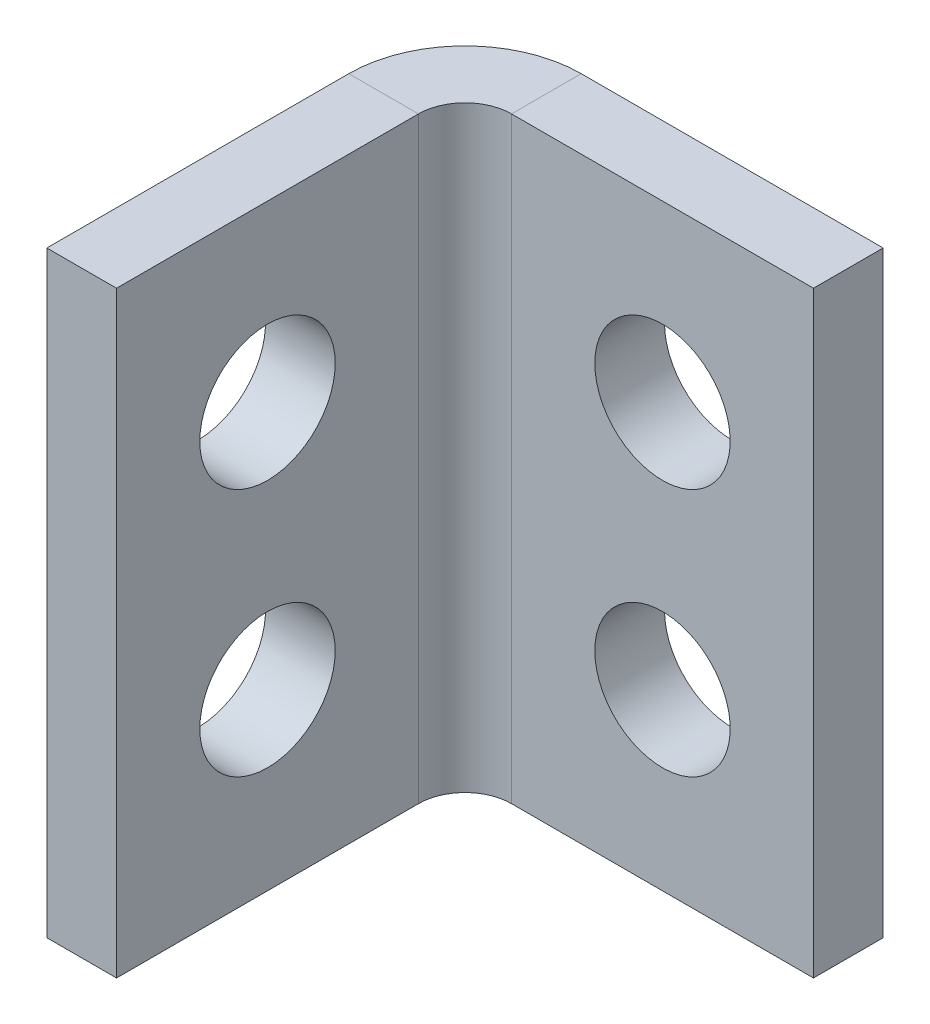
ISO-10303-21;
HEADER;
FILE_DESCRIPTION(('STEP AP214'),'2;1');
FILE_NAME('part.step','',(''),(''),'','','');
FILE_SCHEMA(('AUTOMOTIVE_DESIGN { 1 0 10303 214 1 1 1 1 }'));
ENDSEC;
DATA;
#1=APPLICATION_CONTEXT('core data for automotive mechanical design processes');
#2=APPLICATION_PROTOCOL_DEFINITION('international standard','automotive_design',2000,#1);
#3=PRODUCT_CONTEXT('',#1,'mechanical');
#4=PRODUCT('Part','Part','',(#3));
#5=PRODUCT_RELATED_PRODUCT_CATEGORY('part','',(#4));
#6=PRODUCT_DEFINITION_FORMATION('','',#4);
#7=PRODUCT_DEFINITION_CONTEXT('part definition',#1,'design');
#8=PRODUCT_DEFINITION('design','',#6,#7);
#9=PRODUCT_DEFINITION_SHAPE('','',#8);
#10=(LENGTH_UNIT() NAMED_UNIT(*) SI_UNIT(.MILLI.,.METRE.));
#11=(NAMED_UNIT(*) PLANE_ANGLE_UNIT() SI_UNIT($,.RADIAN.));
#12=(NAMED_UNIT(*) SI_UNIT($,.STERADIAN.) SOLID_ANGLE_UNIT());
#13=UNCERTAINTY_MEASURE_WITH_UNIT(LENGTH_MEASURE(1.E-05),#10,'distance_accuracy_value','');
#14=(GEOMETRIC_REPRESENTATION_CONTEXT(3) GLOBAL_UNCERTAINTY_ASSIGNED_CONTEXT((#13)) GLOBAL_UNIT_ASSIGNED_CONTEXT((#10,
#11,#12)) REPRESENTATION_CONTEXT('',''));
#15=CARTESIAN_POINT('',(0.,0.,0.));
#16=DIRECTION('',(0.,0.,1.));
#17=DIRECTION('',(1.,0.,0.));
#18=AXIS2_PLACEMENT_3D('',#15,#16,#17);
#19=CARTESIAN_POINT('',(0.,0.,-1.75));
#20=DIRECTION('',(0.,-1.,0.));
#21=DIRECTION('',(0.,0.,-1.));
#22=AXIS2_PLACEMENT_3D('',#19,#20,#21);
#23=PLANE('',#22);
#24=DIRECTION('',(1.,0.,0.));
#25=VECTOR('',#24,1.);
#26=CARTESIAN_POINT('',(0.,0.,0.));
#27=LINE('',#26,#25);
#28=CARTESIAN_POINT('',(1.1684,0.,0.));
#29=VERTEX_POINT('',#28);
#30=CARTESIAN_POINT('',(8.75,0.,0.));
#31=VERTEX_POINT('',#30);
#32=EDGE_CURVE('E103',#29,#31,#27,.T.);
#33=ORIENTED_EDGE('',*,*,#32,.F.);
#34=DIRECTION('',(0.,0.,-1.));
#35=VECTOR('',#34,1.);
#36=CARTESIAN_POINT('',(1.1684,0.,0.));
#37=LINE('',#36,#35);
#38=CARTESIAN_POINT('',(1.1684,0.,-1.75));
#39=VERTEX_POINT('',#38);
#40=EDGE_CURVE('E123',#29,#39,#37,.T.);
#41=ORIENTED_EDGE('',*,*,#40,.T.);
#42=DIRECTION('',(1.,0.,0.));
#43=VECTOR('',#42,1.);
#44=CARTESIAN_POINT('',(0.,0.,-1.75));
#45=LINE('',#44,#43);
#46=CARTESIAN_POINT('',(8.75,0.,-1.75));
#47=VERTEX_POINT('',#46);
#48=EDGE_CURVE('E110',#39,#47,#45,.T.);
#49=ORIENTED_EDGE('',*,*,#48,.T.);
#50=DIRECTION('',(0.,0.,1.));
#51=VECTOR('',#50,1.);
#52=CARTESIAN_POINT('',(8.75,0.,-1.75));
#53=LINE('',#52,#51);
#54=EDGE_CURVE('E52',#47,#31,#53,.T.);
#55=ORIENTED_EDGE('',*,*,#54,.T.);
#56=EDGE_LOOP('',(#33,#41,#49,#55));
#57=FACE_BOUND('',#56,.T.);
#58=ADVANCED_FACE('F49',(#57),#23,.T.);
#59=CARTESIAN_POINT('',(0.,0.,-1.75));
#60=DIRECTION('',(0.,0.,-1.));
#61=DIRECTION('',(-1.,0.,0.));
#62=AXIS2_PLACEMENT_3D('',#59,#60,#61);
#63=PLANE('',#62);
#64=CARTESIAN_POINT('',(4.9592,10.625,-1.75));
#65=DIRECTION('',(0.,0.,-1.));
#66=DIRECTION('',(-1.,0.,0.));
#67=AXIS2_PLACEMENT_3D('',#64,#65,#66);
#68=CIRCLE('',#67,1.69999999999999);
#69=CARTESIAN_POINT('',(3.25920000000001,10.625,-1.75));
#70=VERTEX_POINT('',#69);
#71=EDGE_CURVE('E209',#70,#70,#68,.T.);
#72=ORIENTED_EDGE('',*,*,#71,.F.);
#73=EDGE_LOOP('',(#72));
#74=FACE_BOUND('',#73,.T.);
#75=CARTESIAN_POINT('',(4.9592,4.375,-1.75));
#76=DIRECTION('',(0.,0.,-1.));
#77=DIRECTION('',(-1.,0.,0.));
#78=AXIS2_PLACEMENT_3D('',#75,#76,#77);
#79=CIRCLE('',#78,1.69999999999999);
#80=CARTESIAN_POINT('',(3.25920000000001,4.375,-1.75));
#81=VERTEX_POINT('',#80);
#82=EDGE_CURVE('E208',#81,#81,#79,.T.);
#83=ORIENTED_EDGE('',*,*,#82,.F.);
#84=EDGE_LOOP('',(#83));
#85=FACE_BOUND('',#84,.T.);
#86=ORIENTED_EDGE('',*,*,#48,.F.);
#87=DIRECTION('',(0.,-1.,0.));
#88=VECTOR('',#87,1.);
#89=CARTESIAN_POINT('',(1.1684,0.,-1.75));
#90=LINE('',#89,#88);
#91=CARTESIAN_POINT('',(1.1684,15.,-1.75));
#92=VERTEX_POINT('',#91);
#93=EDGE_CURVE('E144',#39,#92,#90,.F.);
#94=ORIENTED_EDGE('',*,*,#93,.T.);
#95=DIRECTION('',(-1.,0.,0.));
#96=VECTOR('',#95,1.);
#97=CARTESIAN_POINT('',(0.,15.,-1.75));
#98=LINE('',#97,#96);
#99=CARTESIAN_POINT('',(8.75,15.,-1.75));
#100=VERTEX_POINT('',#99);
#101=EDGE_CURVE('E119',#100,#92,#98,.T.);
#102=ORIENTED_EDGE('',*,*,#101,.F.);
#103=DIRECTION('',(0.,1.,0.));
#104=VECTOR('',#103,1.);
#105=CARTESIAN_POINT('',(8.75,0.,-1.75));
#106=LINE('',#105,#104);
#107=EDGE_CURVE('E93',#47,#100,#106,.T.);
#108=ORIENTED_EDGE('',*,*,#107,.F.);
#109=EDGE_LOOP('',(#86,#94,#102,#108));
#110=FACE_BOUND('',#109,.T.);
#111=ADVANCED_FACE('F289',(#74,#85,#110),#63,.T.);
#112=CARTESIAN_POINT('',(0.,0.,0.));
#113=DIRECTION('',(0.,0.,-1.));
#114=DIRECTION('',(-1.,0.,0.));
#115=AXIS2_PLACEMENT_3D('',#112,#113,#114);
#116=PLANE('',#115);
#117=CARTESIAN_POINT('',(4.9592,10.625,0.));
#118=DIRECTION('',(0.,0.,-1.));
#119=DIRECTION('',(-1.,0.,0.));
#120=AXIS2_PLACEMENT_3D('',#117,#118,#119);
#121=CIRCLE('',#120,1.69999999999999);
#122=CARTESIAN_POINT('',(3.2592,10.625,0.));
#123=VERTEX_POINT('',#122);
#124=EDGE_CURVE('E202',#123,#123,#121,.T.);
#125=ORIENTED_EDGE('',*,*,#124,.T.);
#126=EDGE_LOOP('',(#125));
#127=FACE_BOUND('',#126,.T.);
#128=CARTESIAN_POINT('',(4.9592,4.375,0.));
#129=DIRECTION('',(0.,0.,-1.));
#130=DIRECTION('',(-1.,0.,0.));
#131=AXIS2_PLACEMENT_3D('',#128,#129,#130);
#132=CIRCLE('',#131,1.69999999999999);
#133=CARTESIAN_POINT('',(3.25920000000001,4.375,0.));
#134=VERTEX_POINT('',#133);
#135=EDGE_CURVE('E211',#134,#134,#132,.T.);
#136=ORIENTED_EDGE('',*,*,#135,.T.);
#137=EDGE_LOOP('',(#136));
#138=FACE_BOUND('',#137,.T.);
#139=DIRECTION('',(0.,-1.,0.));
#140=VECTOR('',#139,1.);
#141=CARTESIAN_POINT('',(1.1684,0.,0.));
#142=LINE('',#141,#140);
#143=CARTESIAN_POINT('',(1.1684,15.,0.));
#144=VERTEX_POINT('',#143);
#145=EDGE_CURVE('E131',#29,#144,#142,.F.);
#146=ORIENTED_EDGE('',*,*,#145,.F.);
#147=ORIENTED_EDGE('',*,*,#32,.T.);
#148=DIRECTION('',(0.,1.,0.));
#149=VECTOR('',#148,1.);
#150=CARTESIAN_POINT('',(8.75,0.,0.));
#151=LINE('',#150,#149);
#152=CARTESIAN_POINT('',(8.75,15.,0.));
#153=VERTEX_POINT('',#152);
#154=EDGE_CURVE('E91',#31,#153,#151,.T.);
#155=ORIENTED_EDGE('',*,*,#154,.T.);
#156=DIRECTION('',(-1.,0.,0.));
#157=VECTOR('',#156,1.);
#158=CARTESIAN_POINT('',(0.,15.,0.));
#159=LINE('',#158,#157);
#160=EDGE_CURVE('E100',#153,#144,#159,.T.);
#161=ORIENTED_EDGE('',*,*,#160,.T.);
#162=EDGE_LOOP('',(#146,#147,#155,#161));
#163=FACE_BOUND('',#162,.T.);
#164=ADVANCED_FACE('F98',(#127,#138,#163),#116,.F.);
#165=CARTESIAN_POINT('',(0.,15.,-1.75));
#166=DIRECTION('',(0.,1.,0.));
#167=DIRECTION('',(0.,0.,1.));
#168=AXIS2_PLACEMENT_3D('',#165,#166,#167);
#169=PLANE('',#168);
#170=DIRECTION('',(0.,0.,-1.));
#171=VECTOR('',#170,1.);
#172=CARTESIAN_POINT('',(1.1684,15.,0.));
#173=LINE('',#172,#171);
#174=EDGE_CURVE('E108',#144,#92,#173,.T.);
#175=ORIENTED_EDGE('',*,*,#174,.F.);
#176=ORIENTED_EDGE('',*,*,#160,.F.);
#177=DIRECTION('',(0.,0.,1.));
#178=VECTOR('',#177,1.);
#179=CARTESIAN_POINT('',(8.75,15.,-1.75));
#180=LINE('',#179,#178);
#181=EDGE_CURVE('E12',#100,#153,#180,.T.);
#182=ORIENTED_EDGE('',*,*,#181,.F.);
#183=ORIENTED_EDGE('',*,*,#101,.T.);
#184=EDGE_LOOP('',(#175,#176,#182,#183));
#185=FACE_BOUND('',#184,.T.);
#186=ADVANCED_FACE('F107',(#185),#169,.T.);
#187=CARTESIAN_POINT('',(8.75,0.,-1.75));
#188=DIRECTION('',(1.,0.,0.));
#189=DIRECTION('',(0.,0.,-1.));
#190=AXIS2_PLACEMENT_3D('',#187,#188,#189);
#191=PLANE('',#190);
#192=ORIENTED_EDGE('',*,*,#154,.F.);
#193=ORIENTED_EDGE('',*,*,#54,.F.);
#194=ORIENTED_EDGE('',*,*,#107,.T.);
#195=ORIENTED_EDGE('',*,*,#181,.T.);
#196=EDGE_LOOP('',(#192,#193,#194,#195));
#197=FACE_BOUND('',#196,.T.);
#198=ADVANCED_FACE('F89',(#197),#191,.T.);
#199=CARTESIAN_POINT('',(1.1684,15.,1.1684));
#200=DIRECTION('',(0.,1.,0.));
#201=DIRECTION('',(0.,0.,1.));
#202=AXIS2_PLACEMENT_3D('',#199,#200,#201);
#203=PLANE('',#202);
#204=DIRECTION('',(-1.,0.,0.));
#205=VECTOR('',#204,1.);
#206=CARTESIAN_POINT('',(0.,15.,1.1684));
#207=LINE('',#206,#205);
#208=CARTESIAN_POINT('',(0.,15.,1.1684));
#209=VERTEX_POINT('',#208);
#210=CARTESIAN_POINT('',(-1.75,15.,1.16839999999999));
#211=VERTEX_POINT('',#210);
#212=EDGE_CURVE('E183',#209,#211,#207,.T.);
#213=ORIENTED_EDGE('',*,*,#212,.F.);
#214=CARTESIAN_POINT('',(1.1684,15.,1.1684));
#215=DIRECTION('',(0.,-1.,0.));
#216=DIRECTION('',(0.,0.,-1.));
#217=AXIS2_PLACEMENT_3D('',#214,#215,#216);
#218=CIRCLE('',#217,1.1684);
#219=EDGE_CURVE('E136',#144,#209,#218,.F.);
#220=ORIENTED_EDGE('',*,*,#219,.F.);
#221=ORIENTED_EDGE('',*,*,#174,.T.);
#222=CARTESIAN_POINT('',(1.1684,15.,1.1684));
#223=DIRECTION('',(0.,-1.,0.));
#224=DIRECTION('',(0.,0.,-1.));
#225=AXIS2_PLACEMENT_3D('',#222,#223,#224);
#226=CIRCLE('',#225,2.9184);
#227=EDGE_CURVE('E66',#92,#211,#226,.F.);
#228=ORIENTED_EDGE('',*,*,#227,.T.);
#229=EDGE_LOOP('',(#213,#220,#221,#228));
#230=FACE_BOUND('',#229,.T.);
#231=ADVANCED_FACE('F298',(#230),#203,.T.);
#232=CARTESIAN_POINT('',(1.1684,0.,1.1684));
#233=DIRECTION('',(0.,1.,0.));
#234=DIRECTION('',(0.,0.,1.));
#235=AXIS2_PLACEMENT_3D('',#232,#233,#234);
#236=PLANE('',#235);
#237=CARTESIAN_POINT('',(1.1684,0.,1.1684));
#238=DIRECTION('',(0.,-1.,0.));
#239=DIRECTION('',(0.,0.,-1.));
#240=AXIS2_PLACEMENT_3D('',#237,#238,#239);
#241=CIRCLE('',#240,1.1684);
#242=CARTESIAN_POINT('',(0.,0.,1.1684));
#243=VERTEX_POINT('',#242);
#244=EDGE_CURVE('E127',#243,#29,#241,.T.);
#245=ORIENTED_EDGE('',*,*,#244,.F.);
#246=DIRECTION('',(-1.,0.,0.));
#247=VECTOR('',#246,1.);
#248=CARTESIAN_POINT('',(0.,0.,1.1684));
#249=LINE('',#248,#247);
#250=CARTESIAN_POINT('',(-1.75,0.,1.16839999999999));
#251=VERTEX_POINT('',#250);
#252=EDGE_CURVE('E182',#243,#251,#249,.T.);
#253=ORIENTED_EDGE('',*,*,#252,.T.);
#254=CARTESIAN_POINT('',(1.1684,0.,1.1684));
#255=DIRECTION('',(0.,-1.,0.));
#256=DIRECTION('',(0.,0.,-1.));
#257=AXIS2_PLACEMENT_3D('',#254,#255,#256);
#258=CIRCLE('',#257,2.9184);
#259=EDGE_CURVE('E140',#251,#39,#258,.T.);
#260=ORIENTED_EDGE('',*,*,#259,.T.);
#261=ORIENTED_EDGE('',*,*,#40,.F.);
#262=EDGE_LOOP('',(#245,#253,#260,#261));
#263=FACE_BOUND('',#262,.T.);
#264=ADVANCED_FACE('F285',(#263),#236,.F.);
#265=CARTESIAN_POINT('',(1.1684,0.,1.1684));
#266=DIRECTION('',(0.,-1.,0.));
#267=DIRECTION('',(-1.,0.,0.));
#268=AXIS2_PLACEMENT_3D('',#265,#266,#267);
#269=CYLINDRICAL_SURFACE('',#268,2.9184);
#270=ORIENTED_EDGE('',*,*,#93,.F.);
#271=ORIENTED_EDGE('',*,*,#259,.F.);
#272=DIRECTION('',(0.,1.,0.));
#273=VECTOR('',#272,1.);
#274=CARTESIAN_POINT('',(-1.75,0.,1.16839999999999));
#275=LINE('',#274,#273);
#276=EDGE_CURVE('E169',#251,#211,#275,.T.);
#277=ORIENTED_EDGE('',*,*,#276,.T.);
#278=ORIENTED_EDGE('',*,*,#227,.F.);
#279=EDGE_LOOP('',(#270,#271,#277,#278));
#280=FACE_BOUND('',#279,.T.);
#281=ADVANCED_FACE('F290',(#280),#269,.T.);
#282=CARTESIAN_POINT('',(1.1684,0.,1.1684));
#283=DIRECTION('',(0.,-1.,0.));
#284=DIRECTION('',(-1.,0.,0.));
#285=AXIS2_PLACEMENT_3D('',#282,#283,#284);
#286=CYLINDRICAL_SURFACE('',#285,1.1684);
#287=ORIENTED_EDGE('',*,*,#145,.T.);
#288=ORIENTED_EDGE('',*,*,#219,.T.);
#289=DIRECTION('',(0.,-1.,0.));
#290=VECTOR('',#289,1.);
#291=CARTESIAN_POINT('',(0.,15.,1.1684));
#292=LINE('',#291,#290);
#293=EDGE_CURVE('E186',#209,#243,#292,.T.);
#294=ORIENTED_EDGE('',*,*,#293,.T.);
#295=ORIENTED_EDGE('',*,*,#244,.T.);
#296=EDGE_LOOP('',(#287,#288,#294,#295));
#297=FACE_BOUND('',#296,.T.);
#298=ADVANCED_FACE('F280',(#297),#286,.F.);
#299=CARTESIAN_POINT('',(-1.75000000000003,0.,8.74999999999999));
#300=DIRECTION('',(0.,1.,0.));
#301=DIRECTION('',(0.,0.,1.));
#302=AXIS2_PLACEMENT_3D('',#299,#300,#301);
#303=PLANE('',#302);
#304=ORIENTED_EDGE('',*,*,#252,.F.);
#305=DIRECTION('',(0.,0.,1.));
#306=VECTOR('',#305,1.);
#307=CARTESIAN_POINT('',(0.,0.,8.75));
#308=LINE('',#307,#306);
#309=CARTESIAN_POINT('',(0.,0.,8.75));
#310=VERTEX_POINT('',#309);
#311=EDGE_CURVE('E165',#243,#310,#308,.T.);
#312=ORIENTED_EDGE('',*,*,#311,.T.);
#313=DIRECTION('',(1.,0.,0.));
#314=VECTOR('',#313,1.);
#315=CARTESIAN_POINT('',(-1.75000000000003,0.,8.74999999999999));
#316=LINE('',#315,#314);
#317=CARTESIAN_POINT('',(-1.75000000000003,0.,8.74999999999999));
#318=VERTEX_POINT('',#317);
#319=EDGE_CURVE('E132',#318,#310,#316,.T.);
#320=ORIENTED_EDGE('',*,*,#319,.F.);
#321=DIRECTION('',(0.,0.,1.));
#322=VECTOR('',#321,1.);
#323=CARTESIAN_POINT('',(-1.75000000000003,0.,8.74999999999999));
#324=LINE('',#323,#322);
#325=EDGE_CURVE('E160',#251,#318,#324,.T.);
#326=ORIENTED_EDGE('',*,*,#325,.F.);
#327=EDGE_LOOP('',(#304,#312,#320,#326));
#328=FACE_BOUND('',#327,.T.);
#329=ADVANCED_FACE('F245',(#328),#303,.F.);
#330=CARTESIAN_POINT('',(-1.75,15.,0.));
#331=DIRECTION('',(0.,-1.,0.));
#332=DIRECTION('',(0.,0.,-1.));
#333=AXIS2_PLACEMENT_3D('',#330,#331,#332);
#334=PLANE('',#333);
#335=ORIENTED_EDGE('',*,*,#212,.T.);
#336=DIRECTION('',(0.,0.,-1.));
#337=VECTOR('',#336,1.);
#338=CARTESIAN_POINT('',(-1.75,15.,0.));
#339=LINE('',#338,#337);
#340=CARTESIAN_POINT('',(-1.75000000000003,15.,8.74999999999999));
#341=VERTEX_POINT('',#340);
#342=EDGE_CURVE('E155',#341,#211,#339,.T.);
#343=ORIENTED_EDGE('',*,*,#342,.F.);
#344=DIRECTION('',(1.,0.,0.));
#345=VECTOR('',#344,1.);
#346=CARTESIAN_POINT('',(-1.75000000000003,15.,8.74999999999999));
#347=LINE('',#346,#345);
#348=CARTESIAN_POINT('',(0.,15.,8.75));
#349=VERTEX_POINT('',#348);
#350=EDGE_CURVE('E152',#341,#349,#347,.T.);
#351=ORIENTED_EDGE('',*,*,#350,.T.);
#352=DIRECTION('',(0.,0.,-1.));
#353=VECTOR('',#352,1.);
#354=CARTESIAN_POINT('',(0.,15.,0.));
#355=LINE('',#354,#353);
#356=EDGE_CURVE('E156',#349,#209,#355,.T.);
#357=ORIENTED_EDGE('',*,*,#356,.T.);
#358=EDGE_LOOP('',(#335,#343,#351,#357));
#359=FACE_BOUND('',#358,.T.);
#360=ADVANCED_FACE('F229',(#359),#334,.F.);
#361=CARTESIAN_POINT('',(-1.75,0.,0.));
#362=DIRECTION('',(1.,0.,0.));
#363=DIRECTION('',(0.,0.,-1.));
#364=AXIS2_PLACEMENT_3D('',#361,#362,#363);
#365=PLANE('',#364);
#366=CARTESIAN_POINT('',(-1.75000000000002,10.625,4.95919999999999));
#367=DIRECTION('',(-1.,0.,0.));
#368=DIRECTION('',(0.,0.,1.));
#369=AXIS2_PLACEMENT_3D('',#366,#367,#368);
#370=CIRCLE('',#369,1.69999999999999);
#371=CARTESIAN_POINT('',(-1.75000000000002,10.625,6.65919999999998));
#372=VERTEX_POINT('',#371);
#373=EDGE_CURVE('E499',#372,#372,#370,.T.);
#374=ORIENTED_EDGE('',*,*,#373,.F.);
#375=EDGE_LOOP('',(#374));
#376=FACE_BOUND('',#375,.T.);
#377=CARTESIAN_POINT('',(-1.75000000000002,4.375,4.95919999999999));
#378=DIRECTION('',(-1.,0.,0.));
#379=DIRECTION('',(0.,0.,1.));
#380=AXIS2_PLACEMENT_3D('',#377,#378,#379);
#381=CIRCLE('',#380,1.69999999999999);
#382=CARTESIAN_POINT('',(-1.75000000000002,4.375,6.65919999999998));
#383=VERTEX_POINT('',#382);
#384=EDGE_CURVE('E197',#383,#383,#381,.T.);
#385=ORIENTED_EDGE('',*,*,#384,.F.);
#386=EDGE_LOOP('',(#385));
#387=FACE_BOUND('',#386,.T.);
#388=ORIENTED_EDGE('',*,*,#276,.F.);
#389=ORIENTED_EDGE('',*,*,#325,.T.);
#390=DIRECTION('',(0.,1.,0.));
#391=VECTOR('',#390,1.);
#392=CARTESIAN_POINT('',(-1.75000000000003,15.,8.74999999999999));
#393=LINE('',#392,#391);
#394=EDGE_CURVE('E173',#318,#341,#393,.T.);
#395=ORIENTED_EDGE('',*,*,#394,.T.);
#396=ORIENTED_EDGE('',*,*,#342,.T.);
#397=EDGE_LOOP('',(#388,#389,#395,#396));
#398=FACE_BOUND('',#397,.T.);
#399=ADVANCED_FACE('F225',(#376,#387,#398),#365,.F.);
#400=CARTESIAN_POINT('',(0.,0.,0.));
#401=DIRECTION('',(1.,0.,0.));
#402=DIRECTION('',(0.,0.,-1.));
#403=AXIS2_PLACEMENT_3D('',#400,#401,#402);
#404=PLANE('',#403);
#405=CARTESIAN_POINT('',(0.,10.625,4.9592));
#406=DIRECTION('',(1.,0.,0.));
#407=DIRECTION('',(0.,0.,-1.));
#408=AXIS2_PLACEMENT_3D('',#405,#406,#407);
#409=CIRCLE('',#408,1.69999999999999);
#410=CARTESIAN_POINT('',(0.,10.625,3.25920000000001));
#411=VERTEX_POINT('',#410);
#412=EDGE_CURVE('E496',#411,#411,#409,.T.);
#413=ORIENTED_EDGE('',*,*,#412,.F.);
#414=EDGE_LOOP('',(#413));
#415=FACE_BOUND('',#414,.T.);
#416=CARTESIAN_POINT('',(0.,4.375,4.9592));
#417=DIRECTION('',(1.,0.,0.));
#418=DIRECTION('',(0.,0.,-1.));
#419=AXIS2_PLACEMENT_3D('',#416,#417,#418);
#420=CIRCLE('',#419,1.69999999999999);
#421=CARTESIAN_POINT('',(0.,4.375,3.2592));
#422=VERTEX_POINT('',#421);
#423=EDGE_CURVE('E187',#422,#422,#420,.T.);
#424=ORIENTED_EDGE('',*,*,#423,.F.);
#425=EDGE_LOOP('',(#424));
#426=FACE_BOUND('',#425,.T.);
#427=ORIENTED_EDGE('',*,*,#311,.F.);
#428=ORIENTED_EDGE('',*,*,#293,.F.);
#429=ORIENTED_EDGE('',*,*,#356,.F.);
#430=DIRECTION('',(0.,1.,0.));
#431=VECTOR('',#430,1.);
#432=CARTESIAN_POINT('',(0.,15.,8.75));
#433=LINE('',#432,#431);
#434=EDGE_CURVE('E161',#310,#349,#433,.T.);
#435=ORIENTED_EDGE('',*,*,#434,.F.);
#436=EDGE_LOOP('',(#427,#428,#429,#435));
#437=FACE_BOUND('',#436,.T.);
#438=ADVANCED_FACE('F228',(#415,#426,#437),#404,.T.);
#439=CARTESIAN_POINT('',(-1.75000000000003,15.,8.74999999999999));
#440=DIRECTION('',(0.,0.,-1.));
#441=DIRECTION('',(-1.,0.,0.));
#442=AXIS2_PLACEMENT_3D('',#439,#440,#441);
#443=PLANE('',#442);
#444=ORIENTED_EDGE('',*,*,#434,.T.);
#445=ORIENTED_EDGE('',*,*,#350,.F.);
#446=ORIENTED_EDGE('',*,*,#394,.F.);
#447=ORIENTED_EDGE('',*,*,#319,.T.);
#448=EDGE_LOOP('',(#444,#445,#446,#447));
#449=FACE_BOUND('',#448,.T.);
#450=ADVANCED_FACE('F256',(#449),#443,.F.);
#451=CARTESIAN_POINT('',(-1.75000000000002,4.375,4.95919999999999));
#452=DIRECTION('',(-1.,0.,0.));
#453=DIRECTION('',(0.,0.,1.));
#454=AXIS2_PLACEMENT_3D('',#451,#452,#453);
#455=CYLINDRICAL_SURFACE('',#454,1.69999999999999);
#456=ORIENTED_EDGE('',*,*,#384,.T.);
#457=EDGE_LOOP('',(#456));
#458=FACE_BOUND('',#457,.T.);
#459=ORIENTED_EDGE('',*,*,#423,.T.);
#460=EDGE_LOOP('',(#459));
#461=FACE_BOUND('',#460,.T.);
#462=ADVANCED_FACE('F222',(#458,#461),#455,.F.);
#463=CARTESIAN_POINT('',(4.9592,4.375,-1.75));
#464=DIRECTION('',(0.,0.,-1.));
#465=DIRECTION('',(-1.,0.,0.));
#466=AXIS2_PLACEMENT_3D('',#463,#464,#465);
#467=CYLINDRICAL_SURFACE('',#466,1.69999999999999);
#468=ORIENTED_EDGE('',*,*,#135,.F.);
#469=EDGE_LOOP('',(#468));
#470=FACE_BOUND('',#469,.T.);
#471=ORIENTED_EDGE('',*,*,#82,.T.);
#472=EDGE_LOOP('',(#471));
#473=FACE_BOUND('',#472,.T.);
#474=ADVANCED_FACE('F355',(#470,#473),#467,.F.);
#475=CARTESIAN_POINT('',(4.9592,10.625,-1.75));
#476=DIRECTION('',(0.,0.,-1.));
#477=DIRECTION('',(-1.,0.,0.));
#478=AXIS2_PLACEMENT_3D('',#475,#476,#477);
#479=CYLINDRICAL_SURFACE('',#478,1.69999999999999);
#480=ORIENTED_EDGE('',*,*,#124,.F.);
#481=EDGE_LOOP('',(#480));
#482=FACE_BOUND('',#481,.T.);
#483=ORIENTED_EDGE('',*,*,#71,.T.);
#484=EDGE_LOOP('',(#483));
#485=FACE_BOUND('',#484,.T.);
#486=ADVANCED_FACE('F349',(#482,#485),#479,.F.);
#487=CARTESIAN_POINT('',(-1.75000000000002,10.625,4.95919999999999));
#488=DIRECTION('',(-1.,0.,0.));
#489=DIRECTION('',(0.,0.,1.));
#490=AXIS2_PLACEMENT_3D('',#487,#488,#489);
#491=CYLINDRICAL_SURFACE('',#490,1.69999999999999);
#492=ORIENTED_EDGE('',*,*,#373,.T.);
#493=EDGE_LOOP('',(#492));
#494=FACE_BOUND('',#493,.T.);
#495=ORIENTED_EDGE('',*,*,#412,.T.);
#496=EDGE_LOOP('',(#495));
#497=FACE_BOUND('',#496,.T.);
#498=ADVANCED_FACE('F346',(#494,#497),#491,.F.);
#499=CLOSED_SHELL('',(#58,#111,#164,#186,#198,#231,#264,#281,#298,#329,#360,#399,#438,#450,#462,
#474,#486,#498));
#500=MANIFOLD_SOLID_BREP('B2',#499);
#501=ADVANCED_BREP_SHAPE_REPRESENTATION('',(#18,#500),#14);
#502=SHAPE_DEFINITION_REPRESENTATION(#9,#501);
ENDSEC;
END-ISO-10303-21;
